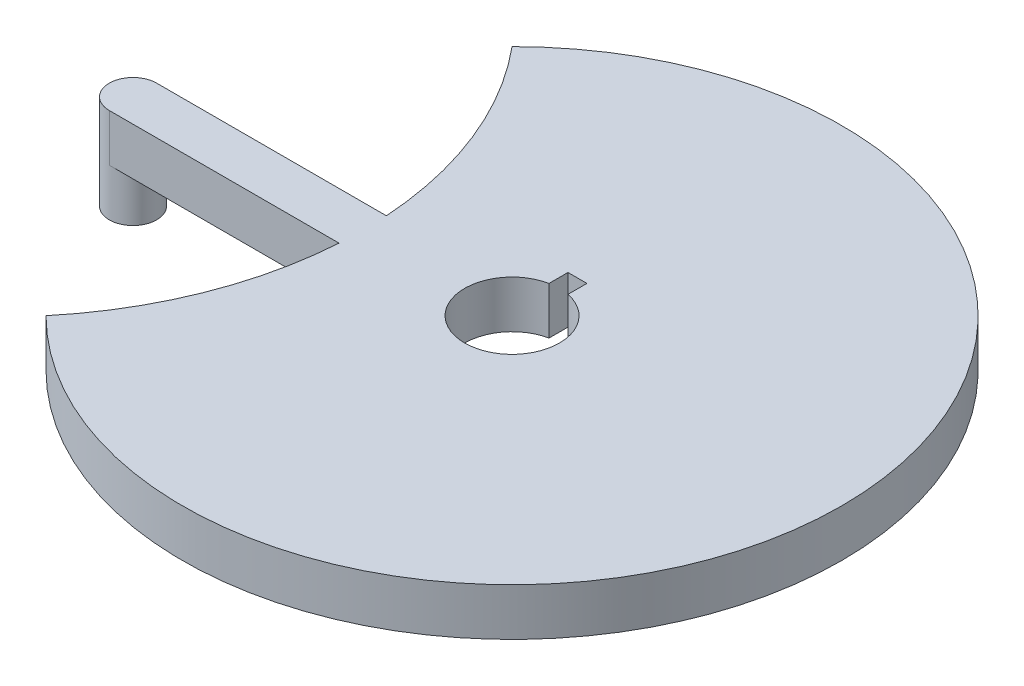
ISO-10303-21;
HEADER;
FILE_DESCRIPTION(('STEP AP214'),'2;1');
FILE_NAME('part.step','',(''),(''),'','','');
FILE_SCHEMA(('AUTOMOTIVE_DESIGN { 1 0 10303 214 1 1 1 1 }'));
ENDSEC;
DATA;
#1=APPLICATION_CONTEXT('core data for automotive mechanical design processes');
#2=APPLICATION_PROTOCOL_DEFINITION('international standard','automotive_design',2000,#1);
#3=PRODUCT_CONTEXT('',#1,'mechanical');
#4=PRODUCT('Part','Part','',(#3));
#5=PRODUCT_RELATED_PRODUCT_CATEGORY('part','',(#4));
#6=PRODUCT_DEFINITION_FORMATION('','',#4);
#7=PRODUCT_DEFINITION_CONTEXT('part definition',#1,'design');
#8=PRODUCT_DEFINITION('design','',#6,#7);
#9=PRODUCT_DEFINITION_SHAPE('','',#8);
#10=(LENGTH_UNIT() NAMED_UNIT(*) SI_UNIT(.MILLI.,.METRE.));
#11=(NAMED_UNIT(*) PLANE_ANGLE_UNIT() SI_UNIT($,.RADIAN.));
#12=(NAMED_UNIT(*) SI_UNIT($,.STERADIAN.) SOLID_ANGLE_UNIT());
#13=UNCERTAINTY_MEASURE_WITH_UNIT(LENGTH_MEASURE(1.E-05),#10,'distance_accuracy_value','');
#14=(GEOMETRIC_REPRESENTATION_CONTEXT(3) GLOBAL_UNCERTAINTY_ASSIGNED_CONTEXT((#13)) GLOBAL_UNIT_ASSIGNED_CONTEXT((#10,
#11,#12)) REPRESENTATION_CONTEXT('',''));
#15=CARTESIAN_POINT('',(0.,0.,0.));
#16=DIRECTION('',(0.,0.,1.));
#17=DIRECTION('',(1.,0.,0.));
#18=AXIS2_PLACEMENT_3D('',#15,#16,#17);
#19=CARTESIAN_POINT('',(-80.,0.,0.));
#20=DIRECTION('',(0.,1.,0.));
#21=DIRECTION('',(0.,0.,1.));
#22=AXIS2_PLACEMENT_3D('',#19,#20,#21);
#23=PLANE('',#22);
#24=CARTESIAN_POINT('',(0.,0.,0.));
#25=DIRECTION('',(0.,1.,0.));
#26=DIRECTION('',(0.,0.,1.));
#27=AXIS2_PLACEMENT_3D('',#24,#25,#26);
#28=CIRCLE('',#27,10.);
#29=CARTESIAN_POINT('',(-2.,0.,-9.79795897113271));
#30=VERTEX_POINT('',#29);
#31=CARTESIAN_POINT('',(2.,0.,-9.79795897113271));
#32=VERTEX_POINT('',#31);
#33=EDGE_CURVE('E60',#30,#32,#28,.T.);
#34=ORIENTED_EDGE('',*,*,#33,.T.);
#35=DIRECTION('',(0.,0.,-1.));
#36=VECTOR('',#35,1.);
#37=CARTESIAN_POINT('',(2.,0.,-9.79795897113271));
#38=LINE('',#37,#36);
#39=CARTESIAN_POINT('',(2.,0.,-13.7979589711327));
#40=VERTEX_POINT('',#39);
#41=EDGE_CURVE('E172',#32,#40,#38,.T.);
#42=ORIENTED_EDGE('',*,*,#41,.T.);
#43=DIRECTION('',(-1.,0.,0.));
#44=VECTOR('',#43,1.);
#45=CARTESIAN_POINT('',(-2.,0.,-13.7979589711327));
#46=LINE('',#45,#44);
#47=CARTESIAN_POINT('',(-2.,0.,-13.7979589711327));
#48=VERTEX_POINT('',#47);
#49=EDGE_CURVE('E175',#40,#48,#46,.T.);
#50=ORIENTED_EDGE('',*,*,#49,.T.);
#51=DIRECTION('',(0.,0.,1.));
#52=VECTOR('',#51,1.);
#53=CARTESIAN_POINT('',(-2.,0.,-9.79795897113271));
#54=LINE('',#53,#52);
#55=EDGE_CURVE('E164',#48,#30,#54,.T.);
#56=ORIENTED_EDGE('',*,*,#55,.T.);
#57=EDGE_LOOP('',(#34,#42,#50,#56));
#58=FACE_BOUND('',#57,.T.);
#59=CARTESIAN_POINT('',(-80.,0.,0.));
#60=DIRECTION('',(0.,-1.,0.));
#61=DIRECTION('',(0.,0.,-1.));
#62=AXIS2_PLACEMENT_3D('',#59,#60,#61);
#63=CIRCLE('',#62,5.);
#64=CARTESIAN_POINT('',(-80.,0.,-5.));
#65=VERTEX_POINT('',#64);
#66=CARTESIAN_POINT('',(-80.,0.,5.));
#67=VERTEX_POINT('',#66);
#68=EDGE_CURVE('E116',#65,#67,#63,.T.);
#69=ORIENTED_EDGE('',*,*,#68,.F.);
#70=DIRECTION('',(-1.,0.,0.));
#71=VECTOR('',#70,1.);
#72=CARTESIAN_POINT('',(-80.,0.,-5.));
#73=LINE('',#72,#71);
#74=CARTESIAN_POINT('',(-31.5206742365615,0.,-5.));
#75=VERTEX_POINT('',#74);
#76=EDGE_CURVE('E119',#75,#65,#73,.T.);
#77=ORIENTED_EDGE('',*,*,#76,.F.);
#78=CARTESIAN_POINT('',(-108.123836132993,0.,0.));
#79=DIRECTION('',(0.,-1.,0.));
#80=DIRECTION('',(0.,0.,1.));
#81=AXIS2_PLACEMENT_3D('',#78,#79,#80);
#82=CIRCLE('',#81,76.7661671085045);
#83=CARTESIAN_POINT('',(-49.1801948833498,0.,-49.1801948833495));
#84=VERTEX_POINT('',#83);
#85=EDGE_CURVE('E137',#84,#75,#82,.T.);
#86=ORIENTED_EDGE('',*,*,#85,.F.);
#87=CARTESIAN_POINT('',(0.,0.,0.));
#88=DIRECTION('',(0.,1.,0.));
#89=DIRECTION('',(0.,0.,1.));
#90=AXIS2_PLACEMENT_3D('',#87,#88,#89);
#91=CIRCLE('',#90,69.551298604185);
#92=CARTESIAN_POINT('',(-49.1801948833497,0.,49.1801948833496));
#93=VERTEX_POINT('',#92);
#94=EDGE_CURVE('E194',#93,#84,#91,.T.);
#95=ORIENTED_EDGE('',*,*,#94,.F.);
#96=CARTESIAN_POINT('',(-108.123836132993,0.,0.));
#97=DIRECTION('',(0.,-1.,0.));
#98=DIRECTION('',(0.,0.,1.));
#99=AXIS2_PLACEMENT_3D('',#96,#97,#98);
#100=CIRCLE('',#99,76.7661671085045);
#101=CARTESIAN_POINT('',(-31.5206742365615,0.,5.00000000000002));
#102=VERTEX_POINT('',#101);
#103=EDGE_CURVE('E154',#102,#93,#100,.T.);
#104=ORIENTED_EDGE('',*,*,#103,.F.);
#105=DIRECTION('',(1.,0.,0.));
#106=VECTOR('',#105,1.);
#107=CARTESIAN_POINT('',(-80.,0.,5.));
#108=LINE('',#107,#106);
#109=EDGE_CURVE('E121',#67,#102,#108,.T.);
#110=ORIENTED_EDGE('',*,*,#109,.F.);
#111=EDGE_LOOP('',(#69,#77,#86,#95,#104,#110));
#112=FACE_BOUND('',#111,.T.);
#113=ADVANCED_FACE('F35',(#58,#112),#23,.F.);
#114=CARTESIAN_POINT('',(-80.,10.,0.));
#115=DIRECTION('',(0.,1.,0.));
#116=DIRECTION('',(0.,0.,1.));
#117=AXIS2_PLACEMENT_3D('',#114,#115,#116);
#118=PLANE('',#117);
#119=CARTESIAN_POINT('',(-80.,10.,0.));
#120=DIRECTION('',(0.,1.,0.));
#121=DIRECTION('',(0.,0.,1.));
#122=AXIS2_PLACEMENT_3D('',#119,#120,#121);
#123=CIRCLE('',#122,5.);
#124=CARTESIAN_POINT('',(-80.,10.,-5.));
#125=VERTEX_POINT('',#124);
#126=CARTESIAN_POINT('',(-80.,10.,5.));
#127=VERTEX_POINT('',#126);
#128=EDGE_CURVE('E136',#125,#127,#123,.T.);
#129=ORIENTED_EDGE('',*,*,#128,.T.);
#130=DIRECTION('',(1.,0.,0.));
#131=VECTOR('',#130,1.);
#132=CARTESIAN_POINT('',(-80.,10.,5.));
#133=LINE('',#132,#131);
#134=CARTESIAN_POINT('',(-31.5206742365615,10.,5.00000000000002));
#135=VERTEX_POINT('',#134);
#136=EDGE_CURVE('E186',#127,#135,#133,.T.);
#137=ORIENTED_EDGE('',*,*,#136,.T.);
#138=CARTESIAN_POINT('',(-108.123836132993,10.,0.));
#139=DIRECTION('',(0.,-1.,0.));
#140=DIRECTION('',(0.,0.,1.));
#141=AXIS2_PLACEMENT_3D('',#138,#139,#140);
#142=CIRCLE('',#141,76.7661671085045);
#143=CARTESIAN_POINT('',(-49.1801948833497,10.,49.1801948833496));
#144=VERTEX_POINT('',#143);
#145=EDGE_CURVE('E188',#135,#144,#142,.T.);
#146=ORIENTED_EDGE('',*,*,#145,.T.);
#147=CARTESIAN_POINT('',(0.,10.,0.));
#148=DIRECTION('',(0.,1.,0.));
#149=DIRECTION('',(0.,0.,1.));
#150=AXIS2_PLACEMENT_3D('',#147,#148,#149);
#151=CIRCLE('',#150,69.551298604185);
#152=CARTESIAN_POINT('',(-49.1801948833498,10.,-49.1801948833495));
#153=VERTEX_POINT('',#152);
#154=EDGE_CURVE('E190',#144,#153,#151,.T.);
#155=ORIENTED_EDGE('',*,*,#154,.T.);
#156=CARTESIAN_POINT('',(-108.123836132993,10.,0.));
#157=DIRECTION('',(0.,-1.,0.));
#158=DIRECTION('',(0.,0.,1.));
#159=AXIS2_PLACEMENT_3D('',#156,#157,#158);
#160=CIRCLE('',#159,76.7661671085045);
#161=CARTESIAN_POINT('',(-31.5206742365615,10.,-5.));
#162=VERTEX_POINT('',#161);
#163=EDGE_CURVE('E144',#153,#162,#160,.T.);
#164=ORIENTED_EDGE('',*,*,#163,.T.);
#165=DIRECTION('',(-1.,0.,0.));
#166=VECTOR('',#165,1.);
#167=CARTESIAN_POINT('',(-80.,10.,-5.));
#168=LINE('',#167,#166);
#169=EDGE_CURVE('E141',#162,#125,#168,.T.);
#170=ORIENTED_EDGE('',*,*,#169,.T.);
#171=EDGE_LOOP('',(#129,#137,#146,#155,#164,#170));
#172=FACE_BOUND('',#171,.T.);
#173=DIRECTION('',(0.,0.,-1.));
#174=VECTOR('',#173,1.);
#175=CARTESIAN_POINT('',(2.,10.,-9.79795897113271));
#176=LINE('',#175,#174);
#177=CARTESIAN_POINT('',(2.,10.,-9.79795897113271));
#178=VERTEX_POINT('',#177);
#179=CARTESIAN_POINT('',(2.,10.,-13.7979589711327));
#180=VERTEX_POINT('',#179);
#181=EDGE_CURVE('E163',#178,#180,#176,.T.);
#182=ORIENTED_EDGE('',*,*,#181,.F.);
#183=CARTESIAN_POINT('',(0.,10.,0.));
#184=DIRECTION('',(0.,1.,0.));
#185=DIRECTION('',(0.,0.,1.));
#186=AXIS2_PLACEMENT_3D('',#183,#184,#185);
#187=CIRCLE('',#186,10.);
#188=CARTESIAN_POINT('',(-2.,10.,-9.79795897113271));
#189=VERTEX_POINT('',#188);
#190=EDGE_CURVE('E161',#189,#178,#187,.T.);
#191=ORIENTED_EDGE('',*,*,#190,.F.);
#192=DIRECTION('',(0.,0.,1.));
#193=VECTOR('',#192,1.);
#194=CARTESIAN_POINT('',(-2.,10.,-9.79795897113271));
#195=LINE('',#194,#193);
#196=CARTESIAN_POINT('',(-2.,10.,-13.7979589711327));
#197=VERTEX_POINT('',#196);
#198=EDGE_CURVE('E168',#197,#189,#195,.T.);
#199=ORIENTED_EDGE('',*,*,#198,.F.);
#200=DIRECTION('',(-1.,0.,0.));
#201=VECTOR('',#200,1.);
#202=CARTESIAN_POINT('',(-2.,10.,-13.7979589711327));
#203=LINE('',#202,#201);
#204=EDGE_CURVE('E166',#180,#197,#203,.T.);
#205=ORIENTED_EDGE('',*,*,#204,.F.);
#206=EDGE_LOOP('',(#182,#191,#199,#205));
#207=FACE_BOUND('',#206,.T.);
#208=ADVANCED_FACE('F216',(#172,#207),#118,.T.);
#209=CARTESIAN_POINT('',(-80.,10.,0.));
#210=DIRECTION('',(0.,-1.,0.));
#211=DIRECTION('',(0.,0.,-1.));
#212=AXIS2_PLACEMENT_3D('',#209,#210,#211);
#213=CYLINDRICAL_SURFACE('',#212,5.);
#214=DIRECTION('',(0.,-1.,0.));
#215=VECTOR('',#214,1.);
#216=CARTESIAN_POINT('',(-80.,10.,-5.));
#217=LINE('',#216,#215);
#218=EDGE_CURVE('E132',#125,#65,#217,.T.);
#219=ORIENTED_EDGE('',*,*,#218,.T.);
#220=ORIENTED_EDGE('',*,*,#68,.T.);
#221=DIRECTION('',(0.,-1.,0.));
#222=VECTOR('',#221,1.);
#223=CARTESIAN_POINT('',(-80.,10.,5.));
#224=LINE('',#223,#222);
#225=EDGE_CURVE('E11',#127,#67,#224,.T.);
#226=ORIENTED_EDGE('',*,*,#225,.F.);
#227=ORIENTED_EDGE('',*,*,#128,.F.);
#228=EDGE_LOOP('',(#219,#220,#226,#227));
#229=FACE_BOUND('',#228,.T.);
#230=CARTESIAN_POINT('',(-80.,-10.,0.));
#231=DIRECTION('',(0.,-1.,0.));
#232=DIRECTION('',(0.,0.,-1.));
#233=AXIS2_PLACEMENT_3D('',#230,#231,#232);
#234=CIRCLE('',#233,5.);
#235=CARTESIAN_POINT('',(-80.,-10.,-5.));
#236=VERTEX_POINT('',#235);
#237=EDGE_CURVE('E125',#236,#236,#234,.T.);
#238=ORIENTED_EDGE('',*,*,#237,.F.);
#239=EDGE_LOOP('',(#238));
#240=FACE_BOUND('',#239,.T.);
#241=ADVANCED_FACE('F37',(#229,#240),#213,.T.);
#242=CARTESIAN_POINT('',(-80.,10.,5.));
#243=DIRECTION('',(0.,0.,-1.));
#244=DIRECTION('',(-1.,0.,0.));
#245=AXIS2_PLACEMENT_3D('',#242,#243,#244);
#246=PLANE('',#245);
#247=ORIENTED_EDGE('',*,*,#109,.T.);
#248=DIRECTION('',(0.,-1.,0.));
#249=VECTOR('',#248,1.);
#250=CARTESIAN_POINT('',(-31.5206742365615,10.,5.00000000000002));
#251=LINE('',#250,#249);
#252=EDGE_CURVE('E44',#135,#102,#251,.T.);
#253=ORIENTED_EDGE('',*,*,#252,.F.);
#254=ORIENTED_EDGE('',*,*,#136,.F.);
#255=ORIENTED_EDGE('',*,*,#225,.T.);
#256=EDGE_LOOP('',(#247,#253,#254,#255));
#257=FACE_BOUND('',#256,.T.);
#258=ADVANCED_FACE('F218',(#257),#246,.F.);
#259=CARTESIAN_POINT('',(-108.123836132993,10.,0.));
#260=DIRECTION('',(0.,-1.,0.));
#261=DIRECTION('',(0.,0.,-1.));
#262=AXIS2_PLACEMENT_3D('',#259,#260,#261);
#263=CYLINDRICAL_SURFACE('',#262,76.7661671085045);
#264=ORIENTED_EDGE('',*,*,#103,.T.);
#265=DIRECTION('',(0.,-1.,0.));
#266=VECTOR('',#265,1.);
#267=CARTESIAN_POINT('',(-49.1801948833497,10.,49.1801948833496));
#268=LINE('',#267,#266);
#269=EDGE_CURVE('E198',#144,#93,#268,.T.);
#270=ORIENTED_EDGE('',*,*,#269,.F.);
#271=ORIENTED_EDGE('',*,*,#145,.F.);
#272=ORIENTED_EDGE('',*,*,#252,.T.);
#273=EDGE_LOOP('',(#264,#270,#271,#272));
#274=FACE_BOUND('',#273,.T.);
#275=ADVANCED_FACE('F208',(#274),#263,.F.);
#276=CARTESIAN_POINT('',(0.,10.,0.));
#277=DIRECTION('',(0.,-1.,0.));
#278=DIRECTION('',(0.,0.,-1.));
#279=AXIS2_PLACEMENT_3D('',#276,#277,#278);
#280=CYLINDRICAL_SURFACE('',#279,69.551298604185);
#281=ORIENTED_EDGE('',*,*,#94,.T.);
#282=DIRECTION('',(0.,-1.,0.));
#283=VECTOR('',#282,1.);
#284=CARTESIAN_POINT('',(-49.1801948833498,10.,-49.1801948833495));
#285=LINE('',#284,#283);
#286=EDGE_CURVE('E142',#153,#84,#285,.T.);
#287=ORIENTED_EDGE('',*,*,#286,.F.);
#288=ORIENTED_EDGE('',*,*,#154,.F.);
#289=ORIENTED_EDGE('',*,*,#269,.T.);
#290=EDGE_LOOP('',(#281,#287,#288,#289));
#291=FACE_BOUND('',#290,.T.);
#292=ADVANCED_FACE('F211',(#291),#280,.T.);
#293=CARTESIAN_POINT('',(-108.123836132993,10.,0.));
#294=DIRECTION('',(0.,-1.,0.));
#295=DIRECTION('',(0.,0.,-1.));
#296=AXIS2_PLACEMENT_3D('',#293,#294,#295);
#297=CYLINDRICAL_SURFACE('',#296,76.7661671085045);
#298=ORIENTED_EDGE('',*,*,#85,.T.);
#299=DIRECTION('',(0.,-1.,0.));
#300=VECTOR('',#299,1.);
#301=CARTESIAN_POINT('',(-31.5206742365615,10.,-5.));
#302=LINE('',#301,#300);
#303=EDGE_CURVE('E135',#162,#75,#302,.T.);
#304=ORIENTED_EDGE('',*,*,#303,.F.);
#305=ORIENTED_EDGE('',*,*,#163,.F.);
#306=ORIENTED_EDGE('',*,*,#286,.T.);
#307=EDGE_LOOP('',(#298,#304,#305,#306));
#308=FACE_BOUND('',#307,.T.);
#309=ADVANCED_FACE('F214',(#308),#297,.F.);
#310=CARTESIAN_POINT('',(-80.,10.,-5.));
#311=DIRECTION('',(0.,0.,1.));
#312=DIRECTION('',(1.,0.,0.));
#313=AXIS2_PLACEMENT_3D('',#310,#311,#312);
#314=PLANE('',#313);
#315=ORIENTED_EDGE('',*,*,#76,.T.);
#316=ORIENTED_EDGE('',*,*,#218,.F.);
#317=ORIENTED_EDGE('',*,*,#169,.F.);
#318=ORIENTED_EDGE('',*,*,#303,.T.);
#319=EDGE_LOOP('',(#315,#316,#317,#318));
#320=FACE_BOUND('',#319,.T.);
#321=ADVANCED_FACE('F130',(#320),#314,.F.);
#322=CARTESIAN_POINT('',(0.,10.,0.));
#323=DIRECTION('',(0.,-1.,0.));
#324=DIRECTION('',(0.,0.,-1.));
#325=AXIS2_PLACEMENT_3D('',#322,#323,#324);
#326=CYLINDRICAL_SURFACE('',#325,10.);
#327=ORIENTED_EDGE('',*,*,#33,.F.);
#328=DIRECTION('',(0.,-1.,0.));
#329=VECTOR('',#328,1.);
#330=CARTESIAN_POINT('',(-2.,10.,-9.79795897113271));
#331=LINE('',#330,#329);
#332=EDGE_CURVE('E170',#189,#30,#331,.T.);
#333=ORIENTED_EDGE('',*,*,#332,.F.);
#334=ORIENTED_EDGE('',*,*,#190,.T.);
#335=DIRECTION('',(0.,-1.,0.));
#336=VECTOR('',#335,1.);
#337=CARTESIAN_POINT('',(2.,10.,-9.79795897113271));
#338=LINE('',#337,#336);
#339=EDGE_CURVE('E155',#178,#32,#338,.T.);
#340=ORIENTED_EDGE('',*,*,#339,.T.);
#341=EDGE_LOOP('',(#327,#333,#334,#340));
#342=FACE_BOUND('',#341,.T.);
#343=ADVANCED_FACE('F236',(#342),#326,.F.);
#344=CARTESIAN_POINT('',(2.,10.,-9.79795897113271));
#345=DIRECTION('',(-1.,0.,0.));
#346=DIRECTION('',(0.,0.,1.));
#347=AXIS2_PLACEMENT_3D('',#344,#345,#346);
#348=PLANE('',#347);
#349=ORIENTED_EDGE('',*,*,#41,.F.);
#350=ORIENTED_EDGE('',*,*,#339,.F.);
#351=ORIENTED_EDGE('',*,*,#181,.T.);
#352=DIRECTION('',(0.,-1.,0.));
#353=VECTOR('',#352,1.);
#354=CARTESIAN_POINT('',(2.,10.,-13.7979589711327));
#355=LINE('',#354,#353);
#356=EDGE_CURVE('E182',#180,#40,#355,.T.);
#357=ORIENTED_EDGE('',*,*,#356,.T.);
#358=EDGE_LOOP('',(#349,#350,#351,#357));
#359=FACE_BOUND('',#358,.T.);
#360=ADVANCED_FACE('F259',(#359),#348,.T.);
#361=CARTESIAN_POINT('',(-2.,10.,-13.7979589711327));
#362=DIRECTION('',(0.,0.,1.));
#363=DIRECTION('',(1.,0.,0.));
#364=AXIS2_PLACEMENT_3D('',#361,#362,#363);
#365=PLANE('',#364);
#366=ORIENTED_EDGE('',*,*,#49,.F.);
#367=ORIENTED_EDGE('',*,*,#356,.F.);
#368=ORIENTED_EDGE('',*,*,#204,.T.);
#369=DIRECTION('',(0.,-1.,0.));
#370=VECTOR('',#369,1.);
#371=CARTESIAN_POINT('',(-2.,10.,-13.7979589711327));
#372=LINE('',#371,#370);
#373=EDGE_CURVE('E52',#197,#48,#372,.T.);
#374=ORIENTED_EDGE('',*,*,#373,.T.);
#375=EDGE_LOOP('',(#366,#367,#368,#374));
#376=FACE_BOUND('',#375,.T.);
#377=ADVANCED_FACE('F265',(#376),#365,.T.);
#378=CARTESIAN_POINT('',(-2.,10.,-9.79795897113271));
#379=DIRECTION('',(1.,0.,0.));
#380=DIRECTION('',(0.,0.,-1.));
#381=AXIS2_PLACEMENT_3D('',#378,#379,#380);
#382=PLANE('',#381);
#383=ORIENTED_EDGE('',*,*,#55,.F.);
#384=ORIENTED_EDGE('',*,*,#373,.F.);
#385=ORIENTED_EDGE('',*,*,#198,.T.);
#386=ORIENTED_EDGE('',*,*,#332,.T.);
#387=EDGE_LOOP('',(#383,#384,#385,#386));
#388=FACE_BOUND('',#387,.T.);
#389=ADVANCED_FACE('F273',(#388),#382,.T.);
#390=CARTESIAN_POINT('',(-80.,-10.,0.));
#391=DIRECTION('',(0.,-1.,0.));
#392=DIRECTION('',(0.,0.,-1.));
#393=AXIS2_PLACEMENT_3D('',#390,#391,#392);
#394=PLANE('',#393);
#395=ORIENTED_EDGE('',*,*,#237,.T.);
#396=EDGE_LOOP('',(#395));
#397=FACE_BOUND('',#396,.T.);
#398=ADVANCED_FACE('F281',(#397),#394,.T.);
#399=CLOSED_SHELL('',(#113,#208,#241,#258,#275,#292,#309,#321,#343,#360,#377,#389,#398));
#400=MANIFOLD_SOLID_BREP('B2',#399);
#401=ADVANCED_BREP_SHAPE_REPRESENTATION('',(#18,#400),#14);
#402=SHAPE_DEFINITION_REPRESENTATION(#9,#401);
ENDSEC;
END-ISO-10303-21;
